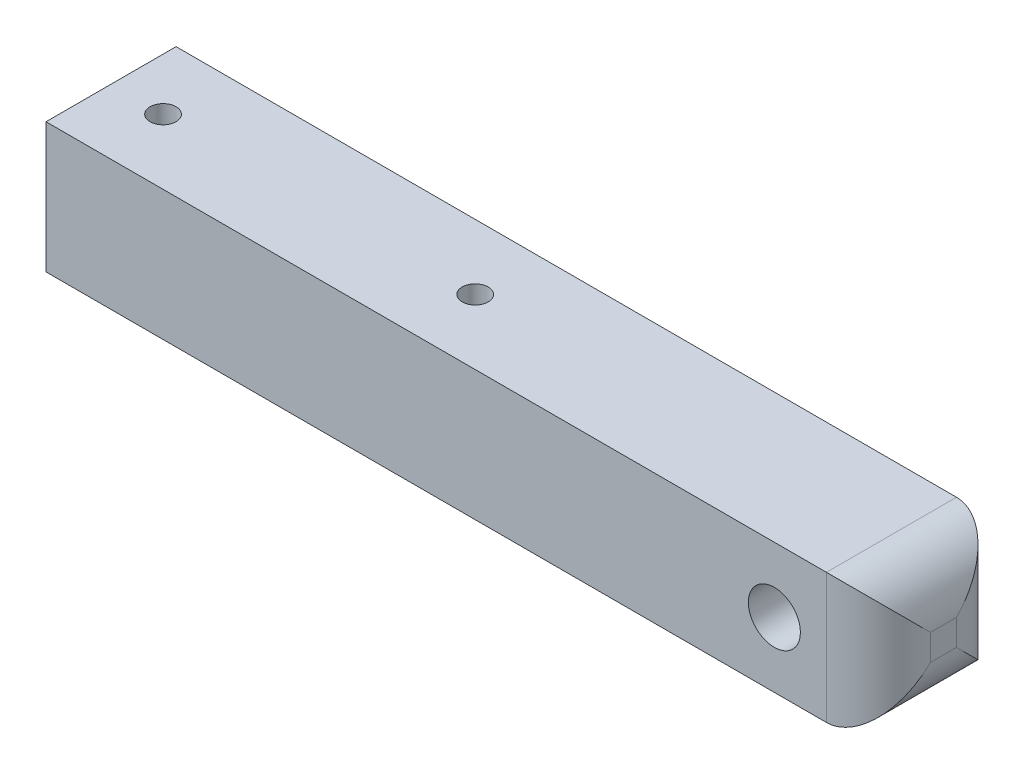
ISO-10303-21;
HEADER;
FILE_DESCRIPTION(('STEP AP214'),'2;1');
FILE_NAME('part.step','',(''),(''),'','','');
FILE_SCHEMA(('AUTOMOTIVE_DESIGN { 1 0 10303 214 1 1 1 1 }'));
ENDSEC;
DATA;
#1=APPLICATION_CONTEXT('core data for automotive mechanical design processes');
#2=APPLICATION_PROTOCOL_DEFINITION('international standard','automotive_design',2000,#1);
#3=PRODUCT_CONTEXT('',#1,'mechanical');
#4=PRODUCT('Part','Part','',(#3));
#5=PRODUCT_RELATED_PRODUCT_CATEGORY('part','',(#4));
#6=PRODUCT_DEFINITION_FORMATION('','',#4);
#7=PRODUCT_DEFINITION_CONTEXT('part definition',#1,'design');
#8=PRODUCT_DEFINITION('design','',#6,#7);
#9=PRODUCT_DEFINITION_SHAPE('','',#8);
#10=(LENGTH_UNIT() NAMED_UNIT(*) SI_UNIT(.MILLI.,.METRE.));
#11=(NAMED_UNIT(*) PLANE_ANGLE_UNIT() SI_UNIT($,.RADIAN.));
#12=(NAMED_UNIT(*) SI_UNIT($,.STERADIAN.) SOLID_ANGLE_UNIT());
#13=UNCERTAINTY_MEASURE_WITH_UNIT(LENGTH_MEASURE(1.E-05),#10,'distance_accuracy_value','');
#14=(GEOMETRIC_REPRESENTATION_CONTEXT(3) GLOBAL_UNCERTAINTY_ASSIGNED_CONTEXT((#13)) GLOBAL_UNIT_ASSIGNED_CONTEXT((#10,
#11,#12)) REPRESENTATION_CONTEXT('',''));
#15=CARTESIAN_POINT('',(0.,0.,0.));
#16=DIRECTION('',(0.,0.,1.));
#17=DIRECTION('',(1.,0.,0.));
#18=AXIS2_PLACEMENT_3D('',#15,#16,#17);
#19=CARTESIAN_POINT('',(0.,0.,15.875));
#20=DIRECTION('',(0.,1.,0.));
#21=DIRECTION('',(0.,0.,1.));
#22=AXIS2_PLACEMENT_3D('',#19,#20,#21);
#23=PLANE('',#22);
#24=CARTESIAN_POINT('',(-88.9,0.,0.));
#25=DIRECTION('',(0.,1.,0.));
#26=DIRECTION('',(0.,0.,1.));
#27=AXIS2_PLACEMENT_3D('',#24,#25,#26);
#28=CIRCLE('',#27,3.175);
#29=CARTESIAN_POINT('',(-88.9,0.,3.175));
#30=VERTEX_POINT('',#29);
#31=EDGE_CURVE('E172',#30,#30,#28,.T.);
#32=ORIENTED_EDGE('',*,*,#31,.T.);
#33=EDGE_LOOP('',(#32));
#34=FACE_BOUND('',#33,.T.);
#35=CARTESIAN_POINT('',(-12.7,0.,0.));
#36=DIRECTION('',(0.,1.,0.));
#37=DIRECTION('',(0.,0.,1.));
#38=AXIS2_PLACEMENT_3D('',#35,#36,#37);
#39=CIRCLE('',#38,3.17499999999999);
#40=CARTESIAN_POINT('',(-12.7,0.,3.17499999999999));
#41=VERTEX_POINT('',#40);
#42=EDGE_CURVE('E277',#41,#41,#39,.T.);
#43=ORIENTED_EDGE('',*,*,#42,.T.);
#44=EDGE_LOOP('',(#43));
#45=FACE_BOUND('',#44,.T.);
#46=DIRECTION('',(1.,0.,0.));
#47=VECTOR('',#46,1.);
#48=CARTESIAN_POINT('',(0.,0.,-15.875));
#49=LINE('',#48,#47);
#50=CARTESIAN_POINT('',(-101.6,0.,-15.875));
#51=VERTEX_POINT('',#50);
#52=CARTESIAN_POINT('',(88.9,0.,-15.875));
#53=VERTEX_POINT('',#52);
#54=EDGE_CURVE('E198',#51,#53,#49,.T.);
#55=ORIENTED_EDGE('',*,*,#54,.T.);
#56=DIRECTION('',(0.,0.,-1.));
#57=VECTOR('',#56,1.);
#58=CARTESIAN_POINT('',(88.9,0.,15.875));
#59=LINE('',#58,#57);
#60=CARTESIAN_POINT('',(88.9,0.,15.875));
#61=VERTEX_POINT('',#60);
#62=EDGE_CURVE('E230',#53,#61,#59,.F.);
#63=ORIENTED_EDGE('',*,*,#62,.T.);
#64=DIRECTION('',(1.,0.,0.));
#65=VECTOR('',#64,1.);
#66=CARTESIAN_POINT('',(-101.6,0.,15.875));
#67=LINE('',#66,#65);
#68=CARTESIAN_POINT('',(-101.6,0.,15.875));
#69=VERTEX_POINT('',#68);
#70=EDGE_CURVE('E187',#69,#61,#67,.T.);
#71=ORIENTED_EDGE('',*,*,#70,.F.);
#72=DIRECTION('',(0.,0.,-1.));
#73=VECTOR('',#72,1.);
#74=CARTESIAN_POINT('',(-101.6,0.,15.875));
#75=LINE('',#74,#73);
#76=EDGE_CURVE('E197',#69,#51,#75,.T.);
#77=ORIENTED_EDGE('',*,*,#76,.T.);
#78=EDGE_LOOP('',(#55,#63,#71,#77));
#79=FACE_BOUND('',#78,.T.);
#80=ADVANCED_FACE('F39',(#34,#45,#79),#23,.F.);
#81=CARTESIAN_POINT('',(101.6,0.,15.875));
#82=DIRECTION('',(-1.,0.,0.));
#83=DIRECTION('',(0.,0.,1.));
#84=AXIS2_PLACEMENT_3D('',#81,#82,#83);
#85=PLANE('',#84);
#86=DIRECTION('',(0.,1.,0.));
#87=VECTOR('',#86,1.);
#88=CARTESIAN_POINT('',(101.6,0.,3.175));
#89=LINE('',#88,#87);
#90=CARTESIAN_POINT('',(101.6,19.05,3.175));
#91=VERTEX_POINT('',#90);
#92=CARTESIAN_POINT('',(101.6,12.7,3.175));
#93=VERTEX_POINT('',#92);
#94=EDGE_CURVE('E160',#91,#93,#89,.F.);
#95=ORIENTED_EDGE('',*,*,#94,.T.);
#96=DIRECTION('',(0.,0.,-1.));
#97=VECTOR('',#96,1.);
#98=CARTESIAN_POINT('',(101.6,12.7,15.875));
#99=LINE('',#98,#97);
#100=CARTESIAN_POINT('',(101.6,12.7,-3.175));
#101=VERTEX_POINT('',#100);
#102=EDGE_CURVE('E226',#93,#101,#99,.T.);
#103=ORIENTED_EDGE('',*,*,#102,.T.);
#104=DIRECTION('',(0.,1.,0.));
#105=VECTOR('',#104,1.);
#106=CARTESIAN_POINT('',(101.6,0.,-3.175));
#107=LINE('',#106,#105);
#108=CARTESIAN_POINT('',(101.6,19.05,-3.175));
#109=VERTEX_POINT('',#108);
#110=EDGE_CURVE('E223',#101,#109,#107,.T.);
#111=ORIENTED_EDGE('',*,*,#110,.T.);
#112=DIRECTION('',(0.,0.,-1.));
#113=VECTOR('',#112,1.);
#114=CARTESIAN_POINT('',(101.6,19.05,15.875));
#115=LINE('',#114,#113);
#116=EDGE_CURVE('E220',#109,#91,#115,.F.);
#117=ORIENTED_EDGE('',*,*,#116,.T.);
#118=EDGE_LOOP('',(#95,#103,#111,#117));
#119=FACE_BOUND('',#118,.T.);
#120=ADVANCED_FACE('F396',(#119),#85,.F.);
#121=CARTESIAN_POINT('',(101.6,31.75,15.875));
#122=DIRECTION('',(0.,-1.,0.));
#123=DIRECTION('',(1.,0.,0.));
#124=AXIS2_PLACEMENT_3D('',#121,#122,#123);
#125=PLANE('',#124);
#126=CARTESIAN_POINT('',(-88.9,31.75,0.));
#127=DIRECTION('',(0.,1.,0.));
#128=DIRECTION('',(0.,0.,1.));
#129=AXIS2_PLACEMENT_3D('',#126,#127,#128);
#130=CIRCLE('',#129,3.175);
#131=CARTESIAN_POINT('',(-88.9,31.75,3.175));
#132=VERTEX_POINT('',#131);
#133=EDGE_CURVE('E253',#132,#132,#130,.T.);
#134=ORIENTED_EDGE('',*,*,#133,.F.);
#135=EDGE_LOOP('',(#134));
#136=FACE_BOUND('',#135,.T.);
#137=CARTESIAN_POINT('',(-12.7,31.75,0.));
#138=DIRECTION('',(0.,1.,0.));
#139=DIRECTION('',(0.,0.,1.));
#140=AXIS2_PLACEMENT_3D('',#137,#138,#139);
#141=CIRCLE('',#140,3.175);
#142=CARTESIAN_POINT('',(-12.7,31.75,3.175));
#143=VERTEX_POINT('',#142);
#144=EDGE_CURVE('E273',#143,#143,#141,.T.);
#145=ORIENTED_EDGE('',*,*,#144,.F.);
#146=EDGE_LOOP('',(#145));
#147=FACE_BOUND('',#146,.T.);
#148=DIRECTION('',(-1.,0.,0.));
#149=VECTOR('',#148,1.);
#150=CARTESIAN_POINT('',(101.6,31.75,15.875));
#151=LINE('',#150,#149);
#152=CARTESIAN_POINT('',(88.9,31.75,15.875));
#153=VERTEX_POINT('',#152);
#154=CARTESIAN_POINT('',(-101.6,31.75,15.875));
#155=VERTEX_POINT('',#154);
#156=EDGE_CURVE('E190',#153,#155,#151,.T.);
#157=ORIENTED_EDGE('',*,*,#156,.F.);
#158=DIRECTION('',(0.,0.,-1.));
#159=VECTOR('',#158,1.);
#160=CARTESIAN_POINT('',(88.9,31.75,15.875));
#161=LINE('',#160,#159);
#162=CARTESIAN_POINT('',(88.9,31.75,-15.875));
#163=VERTEX_POINT('',#162);
#164=EDGE_CURVE('E49',#153,#163,#161,.T.);
#165=ORIENTED_EDGE('',*,*,#164,.T.);
#166=DIRECTION('',(-1.,0.,0.));
#167=VECTOR('',#166,1.);
#168=CARTESIAN_POINT('',(101.6,31.75,-15.875));
#169=LINE('',#168,#167);
#170=CARTESIAN_POINT('',(-101.6,31.75,-15.875));
#171=VERTEX_POINT('',#170);
#172=EDGE_CURVE('E202',#163,#171,#169,.T.);
#173=ORIENTED_EDGE('',*,*,#172,.T.);
#174=DIRECTION('',(0.,0.,-1.));
#175=VECTOR('',#174,1.);
#176=CARTESIAN_POINT('',(-101.6,31.75,15.875));
#177=LINE('',#176,#175);
#178=EDGE_CURVE('E212',#155,#171,#177,.T.);
#179=ORIENTED_EDGE('',*,*,#178,.F.);
#180=EDGE_LOOP('',(#157,#165,#173,#179));
#181=FACE_BOUND('',#180,.T.);
#182=ADVANCED_FACE('F402',(#136,#147,#181),#125,.F.);
#183=CARTESIAN_POINT('',(-101.6,31.75,15.875));
#184=DIRECTION('',(1.,0.,0.));
#185=DIRECTION('',(0.,0.,-1.));
#186=AXIS2_PLACEMENT_3D('',#183,#184,#185);
#187=PLANE('',#186);
#188=DIRECTION('',(0.,0.707106781186548,-0.707106781186547));
#189=VECTOR('',#188,1.);
#190=CARTESIAN_POINT('',(-101.6,4.97105122421384,0.));
#191=LINE('',#190,#189);
#192=CARTESIAN_POINT('',(-101.6,4.97105122421384,0.));
#193=VERTEX_POINT('',#192);
#194=CARTESIAN_POINT('',(-101.6,13.951307345283,-8.98025612106916));
#195=VERTEX_POINT('',#194);
#196=EDGE_CURVE('E327',#193,#195,#191,.T.);
#197=ORIENTED_EDGE('',*,*,#196,.F.);
#198=DIRECTION('',(0.,-0.707106781186548,-0.707106781186547));
#199=VECTOR('',#198,1.);
#200=CARTESIAN_POINT('',(-101.6,13.951307345283,8.98025612106914));
#201=LINE('',#200,#199);
#202=CARTESIAN_POINT('',(-101.6,13.951307345283,8.98025612106914));
#203=VERTEX_POINT('',#202);
#204=EDGE_CURVE('E300',#203,#193,#201,.T.);
#205=ORIENTED_EDGE('',*,*,#204,.F.);
#206=DIRECTION('',(0.,0.707106781186549,-0.707106781186546));
#207=VECTOR('',#206,1.);
#208=CARTESIAN_POINT('',(-101.6,13.0532817331761,9.87828173317606));
#209=LINE('',#208,#207);
#210=CARTESIAN_POINT('',(-101.6,13.0532817331761,9.87828173317606));
#211=VERTEX_POINT('',#210);
#212=EDGE_CURVE('E306',#211,#203,#209,.T.);
#213=ORIENTED_EDGE('',*,*,#212,.F.);
#214=DIRECTION('',(0.,0.707106781186548,0.707106781186547));
#215=VECTOR('',#214,1.);
#216=CARTESIAN_POINT('',(-101.6,3.175,0.));
#217=LINE('',#216,#215);
#218=CARTESIAN_POINT('',(-101.6,3.175,0.));
#219=VERTEX_POINT('',#218);
#220=EDGE_CURVE('E339',#219,#211,#217,.T.);
#221=ORIENTED_EDGE('',*,*,#220,.F.);
#222=DIRECTION('',(0.,-0.707106781186548,0.707106781186547));
#223=VECTOR('',#222,1.);
#224=CARTESIAN_POINT('',(-101.6,13.0532817331761,-9.87828173317606));
#225=LINE('',#224,#223);
#226=CARTESIAN_POINT('',(-101.6,13.0532817331761,-9.87828173317606));
#227=VERTEX_POINT('',#226);
#228=EDGE_CURVE('E335',#227,#219,#225,.T.);
#229=ORIENTED_EDGE('',*,*,#228,.F.);
#230=DIRECTION('',(0.,-0.707106781186563,-0.707106781186532));
#231=VECTOR('',#230,1.);
#232=CARTESIAN_POINT('',(-101.6,13.951307345283,-8.98025612106916));
#233=LINE('',#232,#231);
#234=EDGE_CURVE('E331',#195,#227,#233,.T.);
#235=ORIENTED_EDGE('',*,*,#234,.F.);
#236=EDGE_LOOP('',(#197,#205,#213,#221,#229,#235));
#237=FACE_BOUND('',#236,.T.);
#238=DIRECTION('',(0.,-1.,0.));
#239=VECTOR('',#238,1.);
#240=CARTESIAN_POINT('',(-101.6,31.75,-15.875));
#241=LINE('',#240,#239);
#242=EDGE_CURVE('E191',#171,#51,#241,.T.);
#243=ORIENTED_EDGE('',*,*,#242,.T.);
#244=ORIENTED_EDGE('',*,*,#76,.F.);
#245=DIRECTION('',(0.,-1.,0.));
#246=VECTOR('',#245,1.);
#247=CARTESIAN_POINT('',(-101.6,31.75,15.875));
#248=LINE('',#247,#246);
#249=EDGE_CURVE('E194',#155,#69,#248,.T.);
#250=ORIENTED_EDGE('',*,*,#249,.F.);
#251=ORIENTED_EDGE('',*,*,#178,.T.);
#252=EDGE_LOOP('',(#243,#244,#250,#251));
#253=FACE_BOUND('',#252,.T.);
#254=ADVANCED_FACE('F371',(#237,#253),#187,.F.);
#255=CARTESIAN_POINT('',(0.,0.,15.875));
#256=DIRECTION('',(0.,0.,1.));
#257=DIRECTION('',(1.,0.,0.));
#258=AXIS2_PLACEMENT_3D('',#255,#256,#257);
#259=PLANE('',#258);
#260=CARTESIAN_POINT('',(76.2,15.875,15.875));
#261=DIRECTION('',(0.,0.,1.));
#262=DIRECTION('',(1.,0.,0.));
#263=AXIS2_PLACEMENT_3D('',#260,#261,#262);
#264=CIRCLE('',#263,6.34999999999999);
#265=CARTESIAN_POINT('',(82.55,15.875,15.875));
#266=VERTEX_POINT('',#265);
#267=EDGE_CURVE('E292',#266,#266,#264,.T.);
#268=ORIENTED_EDGE('',*,*,#267,.F.);
#269=EDGE_LOOP('',(#268));
#270=FACE_BOUND('',#269,.T.);
#271=ORIENTED_EDGE('',*,*,#70,.T.);
#272=DIRECTION('',(0.,1.,0.));
#273=VECTOR('',#272,1.);
#274=CARTESIAN_POINT('',(88.9,31.75,15.875));
#275=LINE('',#274,#273);
#276=EDGE_CURVE('E11',#61,#153,#275,.T.);
#277=ORIENTED_EDGE('',*,*,#276,.T.);
#278=ORIENTED_EDGE('',*,*,#156,.T.);
#279=ORIENTED_EDGE('',*,*,#249,.T.);
#280=EDGE_LOOP('',(#271,#277,#278,#279));
#281=FACE_BOUND('',#280,.T.);
#282=ADVANCED_FACE('F533',(#270,#281),#259,.T.);
#283=CARTESIAN_POINT('',(0.,0.,-15.875));
#284=DIRECTION('',(0.,0.,1.));
#285=DIRECTION('',(1.,0.,0.));
#286=AXIS2_PLACEMENT_3D('',#283,#284,#285);
#287=PLANE('',#286);
#288=CARTESIAN_POINT('',(76.2,15.875,-15.875));
#289=DIRECTION('',(0.,0.,1.));
#290=DIRECTION('',(1.,0.,0.));
#291=AXIS2_PLACEMENT_3D('',#288,#289,#290);
#292=CIRCLE('',#291,6.34999999999999);
#293=CARTESIAN_POINT('',(82.55,15.875,-15.875));
#294=VERTEX_POINT('',#293);
#295=EDGE_CURVE('E296',#294,#294,#292,.T.);
#296=ORIENTED_EDGE('',*,*,#295,.T.);
#297=EDGE_LOOP('',(#296));
#298=FACE_BOUND('',#297,.T.);
#299=ORIENTED_EDGE('',*,*,#172,.F.);
#300=DIRECTION('',(0.,1.,0.));
#301=VECTOR('',#300,1.);
#302=CARTESIAN_POINT('',(88.9,0.,-15.875));
#303=LINE('',#302,#301);
#304=EDGE_CURVE('E234',#163,#53,#303,.F.);
#305=ORIENTED_EDGE('',*,*,#304,.T.);
#306=ORIENTED_EDGE('',*,*,#54,.F.);
#307=ORIENTED_EDGE('',*,*,#242,.F.);
#308=EDGE_LOOP('',(#299,#305,#306,#307));
#309=FACE_BOUND('',#308,.T.);
#310=ADVANCED_FACE('F526',(#298,#309),#287,.F.);
#311=CARTESIAN_POINT('',(50.8,13.951307345283,8.98025612106914));
#312=DIRECTION('',(0.,0.707106781186547,-0.707106781186548));
#313=DIRECTION('',(0.,0.707106781186548,0.707106781186547));
#314=AXIS2_PLACEMENT_3D('',#311,#312,#313);
#315=PLANE('',#314);
#316=DIRECTION('',(-1.,0.,0.));
#317=VECTOR('',#316,1.);
#318=CARTESIAN_POINT('',(50.8,4.97105122421384,0.));
#319=LINE('',#318,#317);
#320=CARTESIAN_POINT('',(-92.0749999999999,4.97105122421384,0.));
#321=VERTEX_POINT('',#320);
#322=EDGE_CURVE('E169',#321,#193,#319,.T.);
#323=ORIENTED_EDGE('',*,*,#322,.F.);
#324=CARTESIAN_POINT('',(-88.9,4.97105122421384,0.));
#325=DIRECTION('',(0.,0.707106781186547,-0.707106781186548));
#326=DIRECTION('',(0.,0.707106781186548,0.707106781186547));
#327=AXIS2_PLACEMENT_3D('',#324,#325,#326);
#328=ELLIPSE('',#327,4.49012806053458,3.175);
#329=CARTESIAN_POINT('',(-85.7249999999999,4.97105122421384,0.));
#330=VERTEX_POINT('',#329);
#331=EDGE_CURVE('E155',#321,#330,#328,.T.);
#332=ORIENTED_EDGE('',*,*,#331,.T.);
#333=CARTESIAN_POINT('',(-15.875,4.97105122421384,0.));
#334=VERTEX_POINT('',#333);
#335=EDGE_CURVE('E167',#334,#330,#319,.T.);
#336=ORIENTED_EDGE('',*,*,#335,.F.);
#337=CARTESIAN_POINT('',(-12.7,4.97105122421384,0.));
#338=DIRECTION('',(0.,0.707106781186547,-0.707106781186548));
#339=DIRECTION('',(0.,0.707106781186548,0.707106781186547));
#340=AXIS2_PLACEMENT_3D('',#337,#338,#339);
#341=ELLIPSE('',#340,4.49012806053457,3.17499999999999);
#342=CARTESIAN_POINT('',(-9.52499999999997,4.97105122421384,0.));
#343=VERTEX_POINT('',#342);
#344=EDGE_CURVE('E281',#334,#343,#341,.T.);
#345=ORIENTED_EDGE('',*,*,#344,.T.);
#346=CARTESIAN_POINT('',(50.8,4.97105122421384,0.));
#347=VERTEX_POINT('',#346);
#348=EDGE_CURVE('E178',#347,#343,#319,.T.);
#349=ORIENTED_EDGE('',*,*,#348,.F.);
#350=DIRECTION('',(0.,-0.707106781186548,-0.707106781186547));
#351=VECTOR('',#350,1.);
#352=CARTESIAN_POINT('',(50.8,13.951307345283,8.98025612106914));
#353=LINE('',#352,#351);
#354=CARTESIAN_POINT('',(50.8,13.951307345283,8.98025612106914));
#355=VERTEX_POINT('',#354);
#356=EDGE_CURVE('E301',#355,#347,#353,.T.);
#357=ORIENTED_EDGE('',*,*,#356,.F.);
#358=DIRECTION('',(-1.,0.,0.));
#359=VECTOR('',#358,1.);
#360=CARTESIAN_POINT('',(50.8,13.951307345283,8.98025612106914));
#361=LINE('',#360,#359);
#362=EDGE_CURVE('E203',#355,#203,#361,.T.);
#363=ORIENTED_EDGE('',*,*,#362,.T.);
#364=ORIENTED_EDGE('',*,*,#204,.T.);
#365=EDGE_LOOP('',(#323,#332,#336,#345,#349,#357,#363,#364));
#366=FACE_BOUND('',#365,.T.);
#367=ADVANCED_FACE('F165',(#366),#315,.F.);
#368=CARTESIAN_POINT('',(50.8,13.0532817331761,9.87828173317606));
#369=DIRECTION('',(0.,0.707106781186546,0.707106781186549));
#370=DIRECTION('',(0.,-0.707106781186549,0.707106781186546));
#371=AXIS2_PLACEMENT_3D('',#368,#369,#370);
#372=PLANE('',#371);
#373=ORIENTED_EDGE('',*,*,#212,.T.);
#374=ORIENTED_EDGE('',*,*,#362,.F.);
#375=DIRECTION('',(0.,0.707106781186549,-0.707106781186546));
#376=VECTOR('',#375,1.);
#377=CARTESIAN_POINT('',(50.8,13.0532817331761,9.87828173317606));
#378=LINE('',#377,#376);
#379=CARTESIAN_POINT('',(50.8,13.0532817331761,9.87828173317606));
#380=VERTEX_POINT('',#379);
#381=EDGE_CURVE('E183',#380,#355,#378,.T.);
#382=ORIENTED_EDGE('',*,*,#381,.F.);
#383=DIRECTION('',(-1.,0.,0.));
#384=VECTOR('',#383,1.);
#385=CARTESIAN_POINT('',(50.8,13.0532817331761,9.87828173317606));
#386=LINE('',#385,#384);
#387=EDGE_CURVE('E348',#380,#211,#386,.T.);
#388=ORIENTED_EDGE('',*,*,#387,.T.);
#389=EDGE_LOOP('',(#373,#374,#382,#388));
#390=FACE_BOUND('',#389,.T.);
#391=ADVANCED_FACE('F511',(#390),#372,.F.);
#392=CARTESIAN_POINT('',(50.8,3.175,0.));
#393=DIRECTION('',(0.,-0.707106781186547,0.707106781186548));
#394=DIRECTION('',(0.,-0.707106781186548,-0.707106781186547));
#395=AXIS2_PLACEMENT_3D('',#392,#393,#394);
#396=PLANE('',#395);
#397=DIRECTION('',(-1.,0.,0.));
#398=VECTOR('',#397,1.);
#399=CARTESIAN_POINT('',(50.8,3.175,0.));
#400=LINE('',#399,#398);
#401=CARTESIAN_POINT('',(-15.8749999999999,3.175,0.));
#402=VERTEX_POINT('',#401);
#403=CARTESIAN_POINT('',(-85.7249999999999,3.175,0.));
#404=VERTEX_POINT('',#403);
#405=EDGE_CURVE('E354',#402,#404,#400,.T.);
#406=ORIENTED_EDGE('',*,*,#405,.T.);
#407=CARTESIAN_POINT('',(-88.9,3.175,0.));
#408=DIRECTION('',(0.,-0.707106781186547,0.707106781186548));
#409=DIRECTION('',(0.,0.707106781186548,0.707106781186547));
#410=AXIS2_PLACEMENT_3D('',#407,#408,#409);
#411=ELLIPSE('',#410,4.49012806053458,3.175);
#412=CARTESIAN_POINT('',(-92.0749999999999,3.175,0.));
#413=VERTEX_POINT('',#412);
#414=EDGE_CURVE('E269',#404,#413,#411,.T.);
#415=ORIENTED_EDGE('',*,*,#414,.T.);
#416=EDGE_CURVE('E355',#413,#219,#400,.T.);
#417=ORIENTED_EDGE('',*,*,#416,.T.);
#418=ORIENTED_EDGE('',*,*,#220,.T.);
#419=ORIENTED_EDGE('',*,*,#387,.F.);
#420=DIRECTION('',(0.,0.707106781186548,0.707106781186547));
#421=VECTOR('',#420,1.);
#422=CARTESIAN_POINT('',(50.8,3.175,0.));
#423=LINE('',#422,#421);
#424=CARTESIAN_POINT('',(50.8,3.175,0.));
#425=VERTEX_POINT('',#424);
#426=EDGE_CURVE('E318',#425,#380,#423,.T.);
#427=ORIENTED_EDGE('',*,*,#426,.F.);
#428=CARTESIAN_POINT('',(-9.52499999999996,3.175,0.));
#429=VERTEX_POINT('',#428);
#430=EDGE_CURVE('E351',#425,#429,#400,.T.);
#431=ORIENTED_EDGE('',*,*,#430,.T.);
#432=CARTESIAN_POINT('',(-12.7,3.175,0.));
#433=DIRECTION('',(0.,-0.707106781186547,0.707106781186548));
#434=DIRECTION('',(0.,0.707106781186548,0.707106781186547));
#435=AXIS2_PLACEMENT_3D('',#432,#433,#434);
#436=ELLIPSE('',#435,4.49012806053457,3.17499999999999);
#437=EDGE_CURVE('E288',#429,#402,#436,.T.);
#438=ORIENTED_EDGE('',*,*,#437,.T.);
#439=EDGE_LOOP('',(#406,#415,#417,#418,#419,#427,#431,#438));
#440=FACE_BOUND('',#439,.T.);
#441=ADVANCED_FACE('F380',(#440),#396,.F.);
#442=CARTESIAN_POINT('',(50.8,13.0532817331761,-9.87828173317606));
#443=DIRECTION('',(0.,-0.707106781186547,-0.707106781186548));
#444=DIRECTION('',(0.,0.707106781186548,-0.707106781186547));
#445=AXIS2_PLACEMENT_3D('',#442,#443,#444);
#446=PLANE('',#445);
#447=ORIENTED_EDGE('',*,*,#416,.F.);
#448=CARTESIAN_POINT('',(-88.9,3.175,0.));
#449=DIRECTION('',(0.,-0.707106781186547,-0.707106781186548));
#450=DIRECTION('',(0.,0.707106781186548,-0.707106781186547));
#451=AXIS2_PLACEMENT_3D('',#448,#449,#450);
#452=ELLIPSE('',#451,4.49012806053458,3.175);
#453=EDGE_CURVE('E171',#413,#404,#452,.T.);
#454=ORIENTED_EDGE('',*,*,#453,.T.);
#455=ORIENTED_EDGE('',*,*,#405,.F.);
#456=CARTESIAN_POINT('',(-12.7,3.175,0.));
#457=DIRECTION('',(0.,-0.707106781186547,-0.707106781186548));
#458=DIRECTION('',(0.,0.707106781186548,-0.707106781186547));
#459=AXIS2_PLACEMENT_3D('',#456,#457,#458);
#460=ELLIPSE('',#459,4.49012806053457,3.17499999999999);
#461=EDGE_CURVE('E284',#402,#429,#460,.T.);
#462=ORIENTED_EDGE('',*,*,#461,.T.);
#463=ORIENTED_EDGE('',*,*,#430,.F.);
#464=DIRECTION('',(0.,-0.707106781186548,0.707106781186547));
#465=VECTOR('',#464,1.);
#466=CARTESIAN_POINT('',(50.8,13.0532817331761,-9.87828173317606));
#467=LINE('',#466,#465);
#468=CARTESIAN_POINT('',(50.8,13.0532817331761,-9.87828173317606));
#469=VERTEX_POINT('',#468);
#470=EDGE_CURVE('E314',#469,#425,#467,.T.);
#471=ORIENTED_EDGE('',*,*,#470,.F.);
#472=DIRECTION('',(-1.,0.,0.));
#473=VECTOR('',#472,1.);
#474=CARTESIAN_POINT('',(50.8,13.0532817331761,-9.87828173317606));
#475=LINE('',#474,#473);
#476=EDGE_CURVE('E356',#469,#227,#475,.T.);
#477=ORIENTED_EDGE('',*,*,#476,.T.);
#478=ORIENTED_EDGE('',*,*,#228,.T.);
#479=EDGE_LOOP('',(#447,#454,#455,#462,#463,#471,#477,#478));
#480=FACE_BOUND('',#479,.T.);
#481=ADVANCED_FACE('F376',(#480),#446,.F.);
#482=CARTESIAN_POINT('',(50.8,13.951307345283,-8.98025612106916));
#483=DIRECTION('',(0.,0.707106781186532,-0.707106781186563));
#484=DIRECTION('',(0.,0.707106781186563,0.707106781186532));
#485=AXIS2_PLACEMENT_3D('',#482,#483,#484);
#486=PLANE('',#485);
#487=ORIENTED_EDGE('',*,*,#234,.T.);
#488=ORIENTED_EDGE('',*,*,#476,.F.);
#489=DIRECTION('',(0.,-0.707106781186563,-0.707106781186532));
#490=VECTOR('',#489,1.);
#491=CARTESIAN_POINT('',(50.8,13.951307345283,-8.98025612106916));
#492=LINE('',#491,#490);
#493=CARTESIAN_POINT('',(50.8,13.951307345283,-8.98025612106916));
#494=VERTEX_POINT('',#493);
#495=EDGE_CURVE('E310',#494,#469,#492,.T.);
#496=ORIENTED_EDGE('',*,*,#495,.F.);
#497=DIRECTION('',(-1.,0.,0.));
#498=VECTOR('',#497,1.);
#499=CARTESIAN_POINT('',(50.8,13.951307345283,-8.98025612106916));
#500=LINE('',#499,#498);
#501=EDGE_CURVE('E182',#494,#195,#500,.T.);
#502=ORIENTED_EDGE('',*,*,#501,.T.);
#503=EDGE_LOOP('',(#487,#488,#496,#502));
#504=FACE_BOUND('',#503,.T.);
#505=ADVANCED_FACE('F364',(#504),#486,.F.);
#506=CARTESIAN_POINT('',(50.8,4.97105122421384,0.));
#507=DIRECTION('',(0.,0.707106781186547,0.707106781186548));
#508=DIRECTION('',(0.,-0.707106781186548,0.707106781186547));
#509=AXIS2_PLACEMENT_3D('',#506,#507,#508);
#510=PLANE('',#509);
#511=ORIENTED_EDGE('',*,*,#335,.T.);
#512=CARTESIAN_POINT('',(-88.9,4.97105122421383,0.));
#513=DIRECTION('',(0.,0.707106781186547,0.707106781186548));
#514=DIRECTION('',(0.,0.707106781186548,-0.707106781186547));
#515=AXIS2_PLACEMENT_3D('',#512,#513,#514);
#516=ELLIPSE('',#515,4.49012806053458,3.175);
#517=EDGE_CURVE('E152',#330,#321,#516,.T.);
#518=ORIENTED_EDGE('',*,*,#517,.T.);
#519=ORIENTED_EDGE('',*,*,#322,.T.);
#520=ORIENTED_EDGE('',*,*,#196,.T.);
#521=ORIENTED_EDGE('',*,*,#501,.F.);
#522=DIRECTION('',(0.,0.707106781186548,-0.707106781186547));
#523=VECTOR('',#522,1.);
#524=CARTESIAN_POINT('',(50.8,4.97105122421384,0.));
#525=LINE('',#524,#523);
#526=EDGE_CURVE('E305',#347,#494,#525,.T.);
#527=ORIENTED_EDGE('',*,*,#526,.F.);
#528=ORIENTED_EDGE('',*,*,#348,.T.);
#529=CARTESIAN_POINT('',(-12.7,4.97105122421383,0.));
#530=DIRECTION('',(0.,0.707106781186547,0.707106781186548));
#531=DIRECTION('',(0.,0.707106781186548,-0.707106781186547));
#532=AXIS2_PLACEMENT_3D('',#529,#530,#531);
#533=ELLIPSE('',#532,4.49012806053457,3.17499999999999);
#534=EDGE_CURVE('E161',#343,#334,#533,.T.);
#535=ORIENTED_EDGE('',*,*,#534,.T.);
#536=EDGE_LOOP('',(#511,#518,#519,#520,#521,#527,#528,#535));
#537=FACE_BOUND('',#536,.T.);
#538=ADVANCED_FACE('F175',(#537),#510,.F.);
#539=CARTESIAN_POINT('',(50.8,0.,0.));
#540=DIRECTION('',(1.,0.,0.));
#541=DIRECTION('',(0.,0.,-1.));
#542=AXIS2_PLACEMENT_3D('',#539,#540,#541);
#543=PLANE('',#542);
#544=ORIENTED_EDGE('',*,*,#356,.T.);
#545=ORIENTED_EDGE('',*,*,#526,.T.);
#546=ORIENTED_EDGE('',*,*,#495,.T.);
#547=ORIENTED_EDGE('',*,*,#470,.T.);
#548=ORIENTED_EDGE('',*,*,#426,.T.);
#549=ORIENTED_EDGE('',*,*,#381,.T.);
#550=EDGE_LOOP('',(#544,#545,#546,#547,#548,#549));
#551=FACE_BOUND('',#550,.T.);
#552=ADVANCED_FACE('F472',(#551),#543,.F.);
#553=CARTESIAN_POINT('',(76.2,15.875,15.875));
#554=DIRECTION('',(0.,0.,1.));
#555=DIRECTION('',(1.,0.,0.));
#556=AXIS2_PLACEMENT_3D('',#553,#554,#555);
#557=CYLINDRICAL_SURFACE('',#556,6.34999999999999);
#558=ORIENTED_EDGE('',*,*,#295,.F.);
#559=EDGE_LOOP('',(#558));
#560=FACE_BOUND('',#559,.T.);
#561=ORIENTED_EDGE('',*,*,#267,.T.);
#562=EDGE_LOOP('',(#561));
#563=FACE_BOUND('',#562,.T.);
#564=ADVANCED_FACE('F463',(#560,#563),#557,.F.);
#565=CARTESIAN_POINT('',(-12.7,31.75,0.));
#566=DIRECTION('',(0.,1.,0.));
#567=DIRECTION('',(0.,0.,1.));
#568=AXIS2_PLACEMENT_3D('',#565,#566,#567);
#569=CYLINDRICAL_SURFACE('',#568,3.17499999999999);
#570=ORIENTED_EDGE('',*,*,#144,.T.);
#571=EDGE_LOOP('',(#570));
#572=FACE_BOUND('',#571,.T.);
#573=ORIENTED_EDGE('',*,*,#534,.F.);
#574=ORIENTED_EDGE('',*,*,#344,.F.);
#575=EDGE_LOOP('',(#573,#574));
#576=FACE_BOUND('',#575,.T.);
#577=ADVANCED_FACE('F455',(#572,#576),#569,.F.);
#578=ORIENTED_EDGE('',*,*,#42,.F.);
#579=EDGE_LOOP('',(#578));
#580=FACE_BOUND('',#579,.T.);
#581=ORIENTED_EDGE('',*,*,#461,.F.);
#582=ORIENTED_EDGE('',*,*,#437,.F.);
#583=EDGE_LOOP('',(#581,#582));
#584=FACE_BOUND('',#583,.T.);
#585=ADVANCED_FACE('F392',(#580,#584),#569,.F.);
#586=CARTESIAN_POINT('',(-88.9,31.75,0.));
#587=DIRECTION('',(0.,1.,0.));
#588=DIRECTION('',(0.,0.,1.));
#589=AXIS2_PLACEMENT_3D('',#586,#587,#588);
#590=CYLINDRICAL_SURFACE('',#589,3.175);
#591=ORIENTED_EDGE('',*,*,#133,.T.);
#592=EDGE_LOOP('',(#591));
#593=FACE_BOUND('',#592,.T.);
#594=ORIENTED_EDGE('',*,*,#517,.F.);
#595=ORIENTED_EDGE('',*,*,#331,.F.);
#596=EDGE_LOOP('',(#594,#595));
#597=FACE_BOUND('',#596,.T.);
#598=ADVANCED_FACE('F154',(#593,#597),#590,.F.);
#599=ORIENTED_EDGE('',*,*,#31,.F.);
#600=EDGE_LOOP('',(#599));
#601=FACE_BOUND('',#600,.T.);
#602=ORIENTED_EDGE('',*,*,#453,.F.);
#603=ORIENTED_EDGE('',*,*,#414,.F.);
#604=EDGE_LOOP('',(#602,#603));
#605=FACE_BOUND('',#604,.T.);
#606=ADVANCED_FACE('F382',(#601,#605),#590,.F.);
#607=CARTESIAN_POINT('',(88.9,19.05,15.875));
#608=DIRECTION('',(0.,0.,-1.));
#609=DIRECTION('',(-1.,0.,0.));
#610=AXIS2_PLACEMENT_3D('',#607,#608,#609);
#611=CYLINDRICAL_SURFACE('',#610,12.7);
#612=CARTESIAN_POINT('',(88.9,19.05,-3.175));
#613=DIRECTION('',(0.,-0.707106781186547,-0.707106781186547));
#614=DIRECTION('',(0.,0.707106781186547,-0.707106781186547));
#615=AXIS2_PLACEMENT_3D('',#612,#613,#614);
#616=ELLIPSE('',#615,17.9605122421383,12.7);
#617=EDGE_CURVE('E244',#163,#109,#616,.T.);
#618=ORIENTED_EDGE('',*,*,#617,.F.);
#619=ORIENTED_EDGE('',*,*,#164,.F.);
#620=CARTESIAN_POINT('',(88.9,19.05,3.175));
#621=DIRECTION('',(0.,-0.707106781186547,0.707106781186547));
#622=DIRECTION('',(0.,-0.707106781186547,-0.707106781186547));
#623=AXIS2_PLACEMENT_3D('',#620,#621,#622);
#624=ELLIPSE('',#623,17.9605122421383,12.7);
#625=EDGE_CURVE('E43',#91,#153,#624,.T.);
#626=ORIENTED_EDGE('',*,*,#625,.F.);
#627=ORIENTED_EDGE('',*,*,#116,.F.);
#628=EDGE_LOOP('',(#618,#619,#626,#627));
#629=FACE_BOUND('',#628,.T.);
#630=ADVANCED_FACE('F41',(#629),#611,.T.);
#631=CARTESIAN_POINT('',(88.9,0.,3.175));
#632=DIRECTION('',(0.,-1.,0.));
#633=DIRECTION('',(0.,0.,-1.));
#634=AXIS2_PLACEMENT_3D('',#631,#632,#633);
#635=CYLINDRICAL_SURFACE('',#634,12.7);
#636=ORIENTED_EDGE('',*,*,#625,.T.);
#637=ORIENTED_EDGE('',*,*,#276,.F.);
#638=CARTESIAN_POINT('',(88.9,12.7,3.175));
#639=DIRECTION('',(0.,-0.707106781186547,-0.707106781186547));
#640=DIRECTION('',(0.,-0.707106781186547,0.707106781186547));
#641=AXIS2_PLACEMENT_3D('',#638,#639,#640);
#642=ELLIPSE('',#641,17.9605122421383,12.7);
#643=EDGE_CURVE('E242',#93,#61,#642,.T.);
#644=ORIENTED_EDGE('',*,*,#643,.F.);
#645=ORIENTED_EDGE('',*,*,#94,.F.);
#646=EDGE_LOOP('',(#636,#637,#644,#645));
#647=FACE_BOUND('',#646,.T.);
#648=ADVANCED_FACE('F390',(#647),#635,.T.);
#649=CARTESIAN_POINT('',(88.9,0.,-3.175));
#650=DIRECTION('',(0.,1.,0.));
#651=DIRECTION('',(0.,0.,1.));
#652=AXIS2_PLACEMENT_3D('',#649,#650,#651);
#653=CYLINDRICAL_SURFACE('',#652,12.7);
#654=ORIENTED_EDGE('',*,*,#617,.T.);
#655=ORIENTED_EDGE('',*,*,#110,.F.);
#656=CARTESIAN_POINT('',(88.9,12.7,-3.175));
#657=DIRECTION('',(0.,0.707106781186547,-0.707106781186547));
#658=DIRECTION('',(0.,0.707106781186547,0.707106781186547));
#659=AXIS2_PLACEMENT_3D('',#656,#657,#658);
#660=ELLIPSE('',#659,17.9605122421383,12.7);
#661=EDGE_CURVE('E239',#53,#101,#660,.F.);
#662=ORIENTED_EDGE('',*,*,#661,.F.);
#663=ORIENTED_EDGE('',*,*,#304,.F.);
#664=EDGE_LOOP('',(#654,#655,#662,#663));
#665=FACE_BOUND('',#664,.T.);
#666=ADVANCED_FACE('F411',(#665),#653,.T.);
#667=CARTESIAN_POINT('',(88.9,12.7,15.875));
#668=DIRECTION('',(0.,0.,-1.));
#669=DIRECTION('',(-1.,0.,0.));
#670=AXIS2_PLACEMENT_3D('',#667,#668,#669);
#671=CYLINDRICAL_SURFACE('',#670,12.7);
#672=ORIENTED_EDGE('',*,*,#643,.T.);
#673=ORIENTED_EDGE('',*,*,#62,.F.);
#674=ORIENTED_EDGE('',*,*,#661,.T.);
#675=ORIENTED_EDGE('',*,*,#102,.F.);
#676=EDGE_LOOP('',(#672,#673,#674,#675));
#677=FACE_BOUND('',#676,.T.);
#678=ADVANCED_FACE('F408',(#677),#671,.T.);
#679=CLOSED_SHELL('',(#80,#120,#182,#254,#282,#310,#367,#391,#441,#481,#505,#538,#552,#564,#577,
#585,#598,#606,#630,#648,#666,#678));
#680=MANIFOLD_SOLID_BREP('B2',#679);
#681=ADVANCED_BREP_SHAPE_REPRESENTATION('',(#18,#680),#14);
#682=SHAPE_DEFINITION_REPRESENTATION(#9,#681);
ENDSEC;
END-ISO-10303-21;
